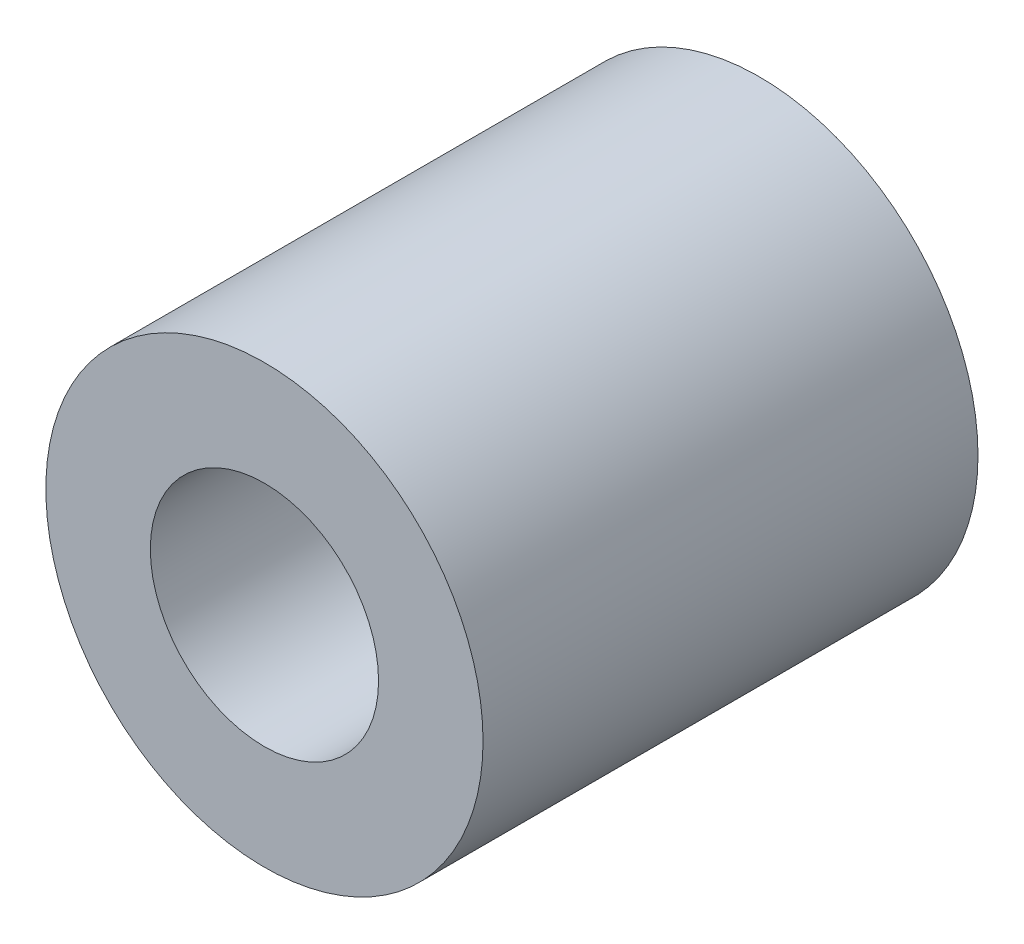
ISO-10303-21;
HEADER;
FILE_DESCRIPTION(('STEP AP214'),'2;1');
FILE_NAME('part.step','',(''),(''),'','','');
FILE_SCHEMA(('AUTOMOTIVE_DESIGN { 1 0 10303 214 1 1 1 1 }'));
ENDSEC;
DATA;
#1=APPLICATION_CONTEXT('core data for automotive mechanical design processes');
#2=APPLICATION_PROTOCOL_DEFINITION('international standard','automotive_design',2000,#1);
#3=PRODUCT_CONTEXT('',#1,'mechanical');
#4=PRODUCT('Part','Part','',(#3));
#5=PRODUCT_RELATED_PRODUCT_CATEGORY('part','',(#4));
#6=PRODUCT_DEFINITION_FORMATION('','',#4);
#7=PRODUCT_DEFINITION_CONTEXT('part definition',#1,'design');
#8=PRODUCT_DEFINITION('design','',#6,#7);
#9=PRODUCT_DEFINITION_SHAPE('','',#8);
#10=(LENGTH_UNIT() NAMED_UNIT(*) SI_UNIT(.MILLI.,.METRE.));
#11=(NAMED_UNIT(*) PLANE_ANGLE_UNIT() SI_UNIT($,.RADIAN.));
#12=(NAMED_UNIT(*) SI_UNIT($,.STERADIAN.) SOLID_ANGLE_UNIT());
#13=UNCERTAINTY_MEASURE_WITH_UNIT(LENGTH_MEASURE(1.E-05),#10,'distance_accuracy_value','');
#14=(GEOMETRIC_REPRESENTATION_CONTEXT(3) GLOBAL_UNCERTAINTY_ASSIGNED_CONTEXT((#13)) GLOBAL_UNIT_ASSIGNED_CONTEXT((#10,
#11,#12)) REPRESENTATION_CONTEXT('',''));
#15=CARTESIAN_POINT('',(0.,0.,0.));
#16=DIRECTION('',(0.,0.,1.));
#17=DIRECTION('',(1.,0.,0.));
#18=AXIS2_PLACEMENT_3D('',#15,#16,#17);
#19=CARTESIAN_POINT('',(0.,0.,18.));
#20=DIRECTION('',(0.,0.,1.));
#21=DIRECTION('',(1.,0.,0.));
#22=AXIS2_PLACEMENT_3D('',#19,#20,#21);
#23=PLANE('',#22);
#24=CARTESIAN_POINT('',(0.,0.,18.));
#25=DIRECTION('',(0.,0.,1.));
#26=DIRECTION('',(1.,0.,0.));
#27=AXIS2_PLACEMENT_3D('',#24,#25,#26);
#28=CIRCLE('',#27,7.95);
#29=CARTESIAN_POINT('',(7.95,0.,18.));
#30=VERTEX_POINT('',#29);
#31=EDGE_CURVE('E10',#30,#30,#28,.T.);
#32=ORIENTED_EDGE('',*,*,#31,.T.);
#33=EDGE_LOOP('',(#32));
#34=FACE_BOUND('',#33,.T.);
#35=CARTESIAN_POINT('',(0.,0.,18.));
#36=DIRECTION('',(0.,0.,1.));
#37=DIRECTION('',(1.,0.,0.));
#38=AXIS2_PLACEMENT_3D('',#35,#36,#37);
#39=CIRCLE('',#38,4.15);
#40=CARTESIAN_POINT('',(4.15,0.,18.));
#41=VERTEX_POINT('',#40);
#42=EDGE_CURVE('E42',#41,#41,#39,.T.);
#43=ORIENTED_EDGE('',*,*,#42,.F.);
#44=EDGE_LOOP('',(#43));
#45=FACE_BOUND('',#44,.T.);
#46=ADVANCED_FACE('F31',(#34,#45),#23,.T.);
#47=CARTESIAN_POINT('',(0.,0.,0.));
#48=DIRECTION('',(0.,0.,1.));
#49=DIRECTION('',(1.,0.,0.));
#50=AXIS2_PLACEMENT_3D('',#47,#48,#49);
#51=PLANE('',#50);
#52=CARTESIAN_POINT('',(0.,0.,0.));
#53=DIRECTION('',(0.,0.,1.));
#54=DIRECTION('',(1.,0.,0.));
#55=AXIS2_PLACEMENT_3D('',#52,#53,#54);
#56=CIRCLE('',#55,7.95);
#57=CARTESIAN_POINT('',(7.95,0.,0.));
#58=VERTEX_POINT('',#57);
#59=EDGE_CURVE('E35',#58,#58,#56,.T.);
#60=ORIENTED_EDGE('',*,*,#59,.F.);
#61=EDGE_LOOP('',(#60));
#62=FACE_BOUND('',#61,.T.);
#63=CARTESIAN_POINT('',(0.,0.,0.));
#64=DIRECTION('',(0.,0.,1.));
#65=DIRECTION('',(1.,0.,0.));
#66=AXIS2_PLACEMENT_3D('',#63,#64,#65);
#67=CIRCLE('',#66,4.15);
#68=CARTESIAN_POINT('',(4.15,0.,0.));
#69=VERTEX_POINT('',#68);
#70=EDGE_CURVE('E44',#69,#69,#67,.T.);
#71=ORIENTED_EDGE('',*,*,#70,.T.);
#72=EDGE_LOOP('',(#71));
#73=FACE_BOUND('',#72,.T.);
#74=ADVANCED_FACE('F54',(#62,#73),#51,.F.);
#75=CARTESIAN_POINT('',(0.,0.,18.));
#76=DIRECTION('',(0.,0.,-1.));
#77=DIRECTION('',(-1.,0.,0.));
#78=AXIS2_PLACEMENT_3D('',#75,#76,#77);
#79=CYLINDRICAL_SURFACE('',#78,7.95);
#80=ORIENTED_EDGE('',*,*,#31,.F.);
#81=EDGE_LOOP('',(#80));
#82=FACE_BOUND('',#81,.T.);
#83=ORIENTED_EDGE('',*,*,#59,.T.);
#84=EDGE_LOOP('',(#83));
#85=FACE_BOUND('',#84,.T.);
#86=ADVANCED_FACE('F33',(#82,#85),#79,.T.);
#87=CARTESIAN_POINT('',(0.,0.,18.));
#88=DIRECTION('',(0.,0.,-1.));
#89=DIRECTION('',(-1.,0.,0.));
#90=AXIS2_PLACEMENT_3D('',#87,#88,#89);
#91=CYLINDRICAL_SURFACE('',#90,4.15);
#92=ORIENTED_EDGE('',*,*,#42,.T.);
#93=EDGE_LOOP('',(#92));
#94=FACE_BOUND('',#93,.T.);
#95=ORIENTED_EDGE('',*,*,#70,.F.);
#96=EDGE_LOOP('',(#95));
#97=FACE_BOUND('',#96,.T.);
#98=ADVANCED_FACE('F50',(#94,#97),#91,.F.);
#99=CLOSED_SHELL('',(#46,#74,#86,#98));
#100=MANIFOLD_SOLID_BREP('B2',#99);
#101=ADVANCED_BREP_SHAPE_REPRESENTATION('',(#18,#100),#14);
#102=SHAPE_DEFINITION_REPRESENTATION(#9,#101);
ENDSEC;
END-ISO-10303-21;
